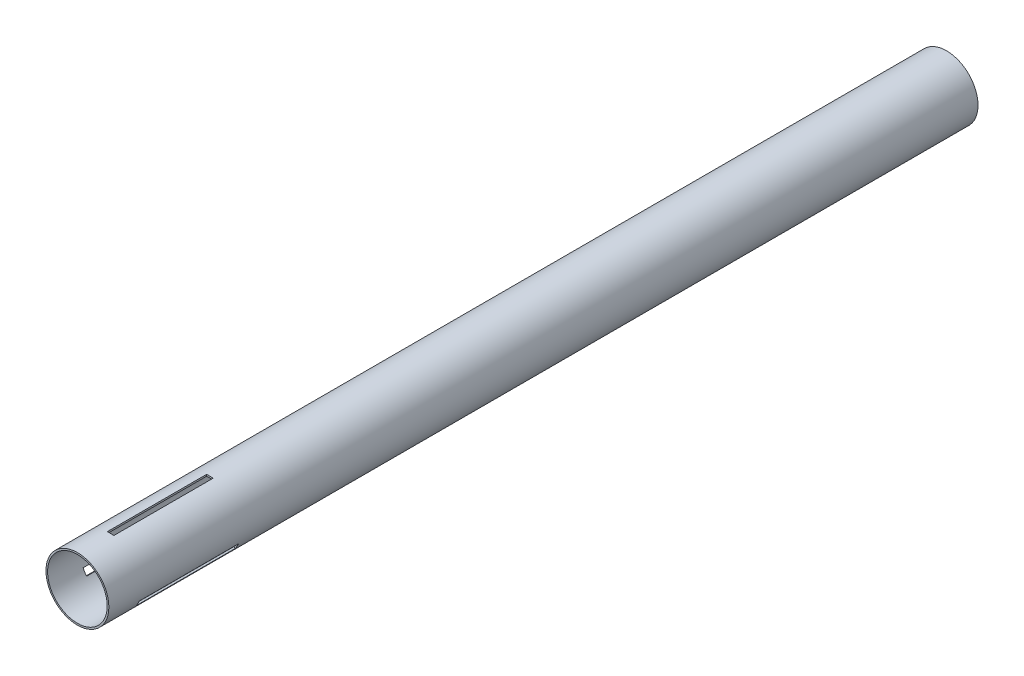
ISO-10303-21;
HEADER;
FILE_DESCRIPTION(('STEP AP214'),'2;1');
FILE_NAME('part.step','',(''),(''),'','','');
FILE_SCHEMA(('AUTOMOTIVE_DESIGN { 1 0 10303 214 1 1 1 1 }'));
ENDSEC;
DATA;
#1=APPLICATION_CONTEXT('core data for automotive mechanical design processes');
#2=APPLICATION_PROTOCOL_DEFINITION('international standard','automotive_design',2000,#1);
#3=PRODUCT_CONTEXT('',#1,'mechanical');
#4=PRODUCT('Part','Part','',(#3));
#5=PRODUCT_RELATED_PRODUCT_CATEGORY('part','',(#4));
#6=PRODUCT_DEFINITION_FORMATION('','',#4);
#7=PRODUCT_DEFINITION_CONTEXT('part definition',#1,'design');
#8=PRODUCT_DEFINITION('design','',#6,#7);
#9=PRODUCT_DEFINITION_SHAPE('','',#8);
#10=(LENGTH_UNIT() NAMED_UNIT(*) SI_UNIT(.MILLI.,.METRE.));
#11=(NAMED_UNIT(*) PLANE_ANGLE_UNIT() SI_UNIT($,.RADIAN.));
#12=(NAMED_UNIT(*) SI_UNIT($,.STERADIAN.) SOLID_ANGLE_UNIT());
#13=UNCERTAINTY_MEASURE_WITH_UNIT(LENGTH_MEASURE(1.E-05),#10,'distance_accuracy_value','');
#14=(GEOMETRIC_REPRESENTATION_CONTEXT(3) GLOBAL_UNCERTAINTY_ASSIGNED_CONTEXT((#13)) GLOBAL_UNIT_ASSIGNED_CONTEXT((#10,
#11,#12)) REPRESENTATION_CONTEXT('',''));
#15=CARTESIAN_POINT('',(0.,0.,0.));
#16=DIRECTION('',(0.,0.,1.));
#17=DIRECTION('',(1.,0.,0.));
#18=AXIS2_PLACEMENT_3D('',#15,#16,#17);
#19=CARTESIAN_POINT('',(0.,0.,525.));
#20=DIRECTION('',(0.,0.,1.));
#21=DIRECTION('',(1.,0.,0.));
#22=AXIS2_PLACEMENT_3D('',#19,#20,#21);
#23=PLANE('',#22);
#24=CARTESIAN_POINT('',(0.,0.,525.));
#25=DIRECTION('',(0.,0.,1.));
#26=DIRECTION('',(1.,0.,0.));
#27=AXIS2_PLACEMENT_3D('',#24,#25,#26);
#28=CIRCLE('',#27,19.);
#29=CARTESIAN_POINT('',(19.,0.,525.));
#30=VERTEX_POINT('',#29);
#31=EDGE_CURVE('E11',#30,#30,#28,.T.);
#32=ORIENTED_EDGE('',*,*,#31,.T.);
#33=EDGE_LOOP('',(#32));
#34=FACE_BOUND('',#33,.T.);
#35=CARTESIAN_POINT('',(0.,0.,525.));
#36=DIRECTION('',(0.,0.,1.));
#37=DIRECTION('',(1.,0.,0.));
#38=AXIS2_PLACEMENT_3D('',#35,#36,#37);
#39=CIRCLE('',#38,18.);
#40=CARTESIAN_POINT('',(18.,0.,525.));
#41=VERTEX_POINT('',#40);
#42=EDGE_CURVE('E213',#41,#41,#39,.T.);
#43=ORIENTED_EDGE('',*,*,#42,.F.);
#44=EDGE_LOOP('',(#43));
#45=FACE_BOUND('',#44,.T.);
#46=ADVANCED_FACE('F33',(#34,#45),#23,.T.);
#47=CARTESIAN_POINT('',(0.,0.,0.));
#48=DIRECTION('',(0.,0.,1.));
#49=DIRECTION('',(1.,0.,0.));
#50=AXIS2_PLACEMENT_3D('',#47,#48,#49);
#51=PLANE('',#50);
#52=CARTESIAN_POINT('',(0.,0.,0.));
#53=DIRECTION('',(0.,0.,1.));
#54=DIRECTION('',(1.,0.,0.));
#55=AXIS2_PLACEMENT_3D('',#52,#53,#54);
#56=CIRCLE('',#55,19.);
#57=CARTESIAN_POINT('',(19.,0.,0.));
#58=VERTEX_POINT('',#57);
#59=EDGE_CURVE('E37',#58,#58,#56,.T.);
#60=ORIENTED_EDGE('',*,*,#59,.F.);
#61=EDGE_LOOP('',(#60));
#62=FACE_BOUND('',#61,.T.);
#63=CARTESIAN_POINT('',(0.,0.,0.));
#64=DIRECTION('',(0.,0.,1.));
#65=DIRECTION('',(1.,0.,0.));
#66=AXIS2_PLACEMENT_3D('',#63,#64,#65);
#67=CIRCLE('',#66,18.);
#68=CARTESIAN_POINT('',(18.,0.,0.));
#69=VERTEX_POINT('',#68);
#70=EDGE_CURVE('E212',#69,#69,#67,.T.);
#71=ORIENTED_EDGE('',*,*,#70,.T.);
#72=EDGE_LOOP('',(#71));
#73=FACE_BOUND('',#72,.T.);
#74=ADVANCED_FACE('F219',(#62,#73),#51,.F.);
#75=CARTESIAN_POINT('',(0.,0.,525.));
#76=DIRECTION('',(0.,0.,-1.));
#77=DIRECTION('',(-1.,0.,0.));
#78=AXIS2_PLACEMENT_3D('',#75,#76,#77);
#79=CYLINDRICAL_SURFACE('',#78,19.);
#80=CARTESIAN_POINT('',(0.,0.,445.));
#81=DIRECTION('',(0.,0.,-1.));
#82=DIRECTION('',(0.499999999999992,-0.866025403784443,0.));
#83=AXIS2_PLACEMENT_3D('',#80,#81,#82);
#84=CIRCLE('',#83,19.);
#85=CARTESIAN_POINT('',(-17.3630681719536,-7.71517100627655,445.));
#86=VERTEX_POINT('',#85);
#87=CARTESIAN_POINT('',(-15.3630681719537,-11.1792726214143,445.));
#88=VERTEX_POINT('',#87);
#89=EDGE_CURVE('E140',#86,#88,#84,.F.);
#90=ORIENTED_EDGE('',*,*,#89,.F.);
#91=DIRECTION('',(0.,0.,-1.));
#92=VECTOR('',#91,1.);
#93=CARTESIAN_POINT('',(-17.3630681719536,-7.71517100627655,525.));
#94=LINE('',#93,#92);
#95=CARTESIAN_POINT('',(-17.3630681719536,-7.71517100627655,505.));
#96=VERTEX_POINT('',#95);
#97=EDGE_CURVE('E135',#96,#86,#94,.T.);
#98=ORIENTED_EDGE('',*,*,#97,.F.);
#99=CARTESIAN_POINT('',(0.,0.,505.));
#100=DIRECTION('',(0.,0.,1.));
#101=DIRECTION('',(-0.499999999999992,0.866025403784443,0.));
#102=AXIS2_PLACEMENT_3D('',#99,#100,#101);
#103=CIRCLE('',#102,19.);
#104=CARTESIAN_POINT('',(-15.3630681719537,-11.1792726214143,505.));
#105=VERTEX_POINT('',#104);
#106=EDGE_CURVE('E124',#105,#96,#103,.F.);
#107=ORIENTED_EDGE('',*,*,#106,.F.);
#108=DIRECTION('',(0.,0.,-1.));
#109=VECTOR('',#108,1.);
#110=CARTESIAN_POINT('',(-15.3630681719537,-11.1792726214143,525.));
#111=LINE('',#110,#109);
#112=EDGE_CURVE('E48',#88,#105,#111,.F.);
#113=ORIENTED_EDGE('',*,*,#112,.F.);
#114=EDGE_LOOP('',(#90,#98,#107,#113));
#115=FACE_BOUND('',#114,.T.);
#116=CARTESIAN_POINT('',(0.,0.,445.));
#117=DIRECTION('',(0.,0.,-1.));
#118=DIRECTION('',(0.500000000000004,0.866025403784436,0.));
#119=AXIS2_PLACEMENT_3D('',#116,#117,#118);
#120=CIRCLE('',#119,19.);
#121=CARTESIAN_POINT('',(15.3630681719535,-11.1792726214145,445.));
#122=VERTEX_POINT('',#121);
#123=CARTESIAN_POINT('',(17.3630681719535,-7.71517100627679,445.));
#124=VERTEX_POINT('',#123);
#125=EDGE_CURVE('E166',#122,#124,#120,.F.);
#126=ORIENTED_EDGE('',*,*,#125,.F.);
#127=DIRECTION('',(0.,0.,-1.));
#128=VECTOR('',#127,1.);
#129=CARTESIAN_POINT('',(15.3630681719535,-11.1792726214145,525.));
#130=LINE('',#129,#128);
#131=CARTESIAN_POINT('',(15.3630681719535,-11.1792726214145,505.));
#132=VERTEX_POINT('',#131);
#133=EDGE_CURVE('E174',#132,#122,#130,.T.);
#134=ORIENTED_EDGE('',*,*,#133,.F.);
#135=CARTESIAN_POINT('',(0.,0.,505.));
#136=DIRECTION('',(0.,0.,1.));
#137=DIRECTION('',(-0.500000000000004,-0.866025403784436,0.));
#138=AXIS2_PLACEMENT_3D('',#135,#136,#137);
#139=CIRCLE('',#138,19.);
#140=CARTESIAN_POINT('',(17.3630681719535,-7.71517100627679,505.));
#141=VERTEX_POINT('',#140);
#142=EDGE_CURVE('E143',#141,#132,#139,.F.);
#143=ORIENTED_EDGE('',*,*,#142,.F.);
#144=DIRECTION('',(0.,0.,-1.));
#145=VECTOR('',#144,1.);
#146=CARTESIAN_POINT('',(17.3630681719535,-7.71517100627679,525.));
#147=LINE('',#146,#145);
#148=EDGE_CURVE('E159',#124,#141,#147,.F.);
#149=ORIENTED_EDGE('',*,*,#148,.F.);
#150=EDGE_LOOP('',(#126,#134,#143,#149));
#151=FACE_BOUND('',#150,.T.);
#152=CARTESIAN_POINT('',(0.,0.,445.));
#153=DIRECTION('',(0.,0.,-1.));
#154=DIRECTION('',(-1.,0.,0.));
#155=AXIS2_PLACEMENT_3D('',#152,#153,#154);
#156=CIRCLE('',#155,19.);
#157=CARTESIAN_POINT('',(2.,18.8944436276912,445.));
#158=VERTEX_POINT('',#157);
#159=CARTESIAN_POINT('',(-2.,18.8944436276912,445.));
#160=VERTEX_POINT('',#159);
#161=EDGE_CURVE('E181',#158,#160,#156,.F.);
#162=ORIENTED_EDGE('',*,*,#161,.F.);
#163=DIRECTION('',(0.,0.,-1.));
#164=VECTOR('',#163,1.);
#165=CARTESIAN_POINT('',(2.,18.8944436276912,525.));
#166=LINE('',#165,#164);
#167=CARTESIAN_POINT('',(2.,18.8944436276912,505.));
#168=VERTEX_POINT('',#167);
#169=EDGE_CURVE('E184',#168,#158,#166,.T.);
#170=ORIENTED_EDGE('',*,*,#169,.F.);
#171=CARTESIAN_POINT('',(0.,0.,505.));
#172=DIRECTION('',(0.,0.,1.));
#173=DIRECTION('',(1.,0.,0.));
#174=AXIS2_PLACEMENT_3D('',#171,#172,#173);
#175=CIRCLE('',#174,19.);
#176=CARTESIAN_POINT('',(-2.,18.8944436276912,505.));
#177=VERTEX_POINT('',#176);
#178=EDGE_CURVE('E186',#177,#168,#175,.F.);
#179=ORIENTED_EDGE('',*,*,#178,.F.);
#180=DIRECTION('',(0.,0.,-1.));
#181=VECTOR('',#180,1.);
#182=CARTESIAN_POINT('',(-2.,18.8944436276912,525.));
#183=LINE('',#182,#181);
#184=EDGE_CURVE('E180',#160,#177,#183,.F.);
#185=ORIENTED_EDGE('',*,*,#184,.F.);
#186=EDGE_LOOP('',(#162,#170,#179,#185));
#187=FACE_BOUND('',#186,.T.);
#188=ORIENTED_EDGE('',*,*,#31,.F.);
#189=EDGE_LOOP('',(#188));
#190=FACE_BOUND('',#189,.T.);
#191=ORIENTED_EDGE('',*,*,#59,.T.);
#192=EDGE_LOOP('',(#191));
#193=FACE_BOUND('',#192,.T.);
#194=ADVANCED_FACE('F35',(#115,#151,#187,#190,#193),#79,.T.);
#195=CARTESIAN_POINT('',(0.,0.,525.));
#196=DIRECTION('',(0.,0.,-1.));
#197=DIRECTION('',(-1.,0.,0.));
#198=AXIS2_PLACEMENT_3D('',#195,#196,#197);
#199=CYLINDRICAL_SURFACE('',#198,18.);
#200=DIRECTION('',(0.,0.,-1.));
#201=VECTOR('',#200,1.);
#202=CARTESIAN_POINT('',(-16.4919333848297,-7.21222110243013,525.));
#203=LINE('',#202,#201);
#204=CARTESIAN_POINT('',(-16.4919333848297,-7.21222110243013,505.));
#205=VERTEX_POINT('',#204);
#206=CARTESIAN_POINT('',(-16.4919333848297,-7.21222110243013,445.));
#207=VERTEX_POINT('',#206);
#208=EDGE_CURVE('E56',#205,#207,#203,.T.);
#209=ORIENTED_EDGE('',*,*,#208,.T.);
#210=CARTESIAN_POINT('',(0.,0.,445.));
#211=DIRECTION('',(0.,0.,-1.));
#212=DIRECTION('',(0.499999999999992,-0.866025403784443,0.));
#213=AXIS2_PLACEMENT_3D('',#210,#211,#212);
#214=CIRCLE('',#213,18.);
#215=CARTESIAN_POINT('',(-14.4919333848298,-10.6763227175679,445.));
#216=VERTEX_POINT('',#215);
#217=EDGE_CURVE('E145',#207,#216,#214,.F.);
#218=ORIENTED_EDGE('',*,*,#217,.T.);
#219=DIRECTION('',(0.,0.,-1.));
#220=VECTOR('',#219,1.);
#221=CARTESIAN_POINT('',(-14.4919333848298,-10.6763227175679,525.));
#222=LINE('',#221,#220);
#223=CARTESIAN_POINT('',(-14.4919333848298,-10.6763227175679,505.));
#224=VERTEX_POINT('',#223);
#225=EDGE_CURVE('E387',#216,#224,#222,.F.);
#226=ORIENTED_EDGE('',*,*,#225,.T.);
#227=CARTESIAN_POINT('',(0.,0.,505.));
#228=DIRECTION('',(0.,0.,1.));
#229=DIRECTION('',(-0.499999999999992,0.866025403784443,0.));
#230=AXIS2_PLACEMENT_3D('',#227,#228,#229);
#231=CIRCLE('',#230,18.);
#232=EDGE_CURVE('E131',#224,#205,#231,.F.);
#233=ORIENTED_EDGE('',*,*,#232,.T.);
#234=EDGE_LOOP('',(#209,#218,#226,#233));
#235=FACE_BOUND('',#234,.T.);
#236=DIRECTION('',(0.,0.,-1.));
#237=VECTOR('',#236,1.);
#238=CARTESIAN_POINT('',(14.4919333848296,-10.6763227175681,525.));
#239=LINE('',#238,#237);
#240=CARTESIAN_POINT('',(14.4919333848296,-10.6763227175681,505.));
#241=VERTEX_POINT('',#240);
#242=CARTESIAN_POINT('',(14.4919333848296,-10.6763227175681,445.));
#243=VERTEX_POINT('',#242);
#244=EDGE_CURVE('E177',#241,#243,#239,.T.);
#245=ORIENTED_EDGE('',*,*,#244,.T.);
#246=CARTESIAN_POINT('',(0.,0.,445.));
#247=DIRECTION('',(0.,0.,-1.));
#248=DIRECTION('',(0.500000000000004,0.866025403784436,0.));
#249=AXIS2_PLACEMENT_3D('',#246,#247,#248);
#250=CIRCLE('',#249,18.);
#251=CARTESIAN_POINT('',(16.4919333848296,-7.21222110243036,445.));
#252=VERTEX_POINT('',#251);
#253=EDGE_CURVE('E169',#243,#252,#250,.F.);
#254=ORIENTED_EDGE('',*,*,#253,.T.);
#255=DIRECTION('',(0.,0.,-1.));
#256=VECTOR('',#255,1.);
#257=CARTESIAN_POINT('',(16.4919333848296,-7.21222110243036,525.));
#258=LINE('',#257,#256);
#259=CARTESIAN_POINT('',(16.4919333848296,-7.21222110243036,505.));
#260=VERTEX_POINT('',#259);
#261=EDGE_CURVE('E161',#252,#260,#258,.F.);
#262=ORIENTED_EDGE('',*,*,#261,.T.);
#263=CARTESIAN_POINT('',(0.,0.,505.));
#264=DIRECTION('',(0.,0.,1.));
#265=DIRECTION('',(-0.500000000000004,-0.866025403784436,0.));
#266=AXIS2_PLACEMENT_3D('',#263,#264,#265);
#267=CIRCLE('',#266,18.);
#268=EDGE_CURVE('E150',#260,#241,#267,.F.);
#269=ORIENTED_EDGE('',*,*,#268,.T.);
#270=EDGE_LOOP('',(#245,#254,#262,#269));
#271=FACE_BOUND('',#270,.T.);
#272=DIRECTION('',(0.,0.,-1.));
#273=VECTOR('',#272,1.);
#274=CARTESIAN_POINT('',(2.,17.8885438199983,525.));
#275=LINE('',#274,#273);
#276=CARTESIAN_POINT('',(2.,17.8885438199983,505.));
#277=VERTEX_POINT('',#276);
#278=CARTESIAN_POINT('',(2.,17.8885438199983,445.));
#279=VERTEX_POINT('',#278);
#280=EDGE_CURVE('E203',#277,#279,#275,.T.);
#281=ORIENTED_EDGE('',*,*,#280,.T.);
#282=CARTESIAN_POINT('',(0.,0.,445.));
#283=DIRECTION('',(0.,0.,-1.));
#284=DIRECTION('',(-1.,0.,0.));
#285=AXIS2_PLACEMENT_3D('',#282,#283,#284);
#286=CIRCLE('',#285,18.);
#287=CARTESIAN_POINT('',(-2.,17.8885438199983,445.));
#288=VERTEX_POINT('',#287);
#289=EDGE_CURVE('E183',#279,#288,#286,.F.);
#290=ORIENTED_EDGE('',*,*,#289,.T.);
#291=DIRECTION('',(0.,0.,-1.));
#292=VECTOR('',#291,1.);
#293=CARTESIAN_POINT('',(-2.,17.8885438199983,525.));
#294=LINE('',#293,#292);
#295=CARTESIAN_POINT('',(-2.,17.8885438199983,505.));
#296=VERTEX_POINT('',#295);
#297=EDGE_CURVE('E193',#288,#296,#294,.F.);
#298=ORIENTED_EDGE('',*,*,#297,.T.);
#299=CARTESIAN_POINT('',(0.,0.,505.));
#300=DIRECTION('',(0.,0.,1.));
#301=DIRECTION('',(1.,0.,0.));
#302=AXIS2_PLACEMENT_3D('',#299,#300,#301);
#303=CIRCLE('',#302,18.);
#304=EDGE_CURVE('E196',#296,#277,#303,.F.);
#305=ORIENTED_EDGE('',*,*,#304,.T.);
#306=EDGE_LOOP('',(#281,#290,#298,#305));
#307=FACE_BOUND('',#306,.T.);
#308=ORIENTED_EDGE('',*,*,#42,.T.);
#309=EDGE_LOOP('',(#308));
#310=FACE_BOUND('',#309,.T.);
#311=ORIENTED_EDGE('',*,*,#70,.F.);
#312=EDGE_LOOP('',(#311));
#313=FACE_BOUND('',#312,.T.);
#314=ADVANCED_FACE('F221',(#235,#271,#307,#310,#313),#199,.F.);
#315=CARTESIAN_POINT('',(2.,-19.001,505.));
#316=DIRECTION('',(1.,0.,0.));
#317=DIRECTION('',(0.,0.,-1.));
#318=AXIS2_PLACEMENT_3D('',#315,#316,#317);
#319=PLANE('',#318);
#320=ORIENTED_EDGE('',*,*,#169,.T.);
#321=DIRECTION('',(0.,1.,0.));
#322=VECTOR('',#321,1.);
#323=CARTESIAN_POINT('',(2.,-19.001,445.));
#324=LINE('',#323,#322);
#325=EDGE_CURVE('E207',#279,#158,#324,.T.);
#326=ORIENTED_EDGE('',*,*,#325,.F.);
#327=ORIENTED_EDGE('',*,*,#280,.F.);
#328=DIRECTION('',(0.,1.,0.));
#329=VECTOR('',#328,1.);
#330=CARTESIAN_POINT('',(2.,-19.001,505.));
#331=LINE('',#330,#329);
#332=EDGE_CURVE('E199',#277,#168,#331,.T.);
#333=ORIENTED_EDGE('',*,*,#332,.T.);
#334=EDGE_LOOP('',(#320,#326,#327,#333));
#335=FACE_BOUND('',#334,.T.);
#336=ADVANCED_FACE('F223',(#335),#319,.F.);
#337=CARTESIAN_POINT('',(-2.,-19.001,445.));
#338=DIRECTION('',(0.,0.,-1.));
#339=DIRECTION('',(-1.,0.,0.));
#340=AXIS2_PLACEMENT_3D('',#337,#338,#339);
#341=PLANE('',#340);
#342=ORIENTED_EDGE('',*,*,#161,.T.);
#343=DIRECTION('',(0.,1.,0.));
#344=VECTOR('',#343,1.);
#345=CARTESIAN_POINT('',(-2.,-19.001,445.));
#346=LINE('',#345,#344);
#347=EDGE_CURVE('E204',#288,#160,#346,.T.);
#348=ORIENTED_EDGE('',*,*,#347,.F.);
#349=ORIENTED_EDGE('',*,*,#289,.F.);
#350=ORIENTED_EDGE('',*,*,#325,.T.);
#351=EDGE_LOOP('',(#342,#348,#349,#350));
#352=FACE_BOUND('',#351,.T.);
#353=ADVANCED_FACE('F230',(#352),#341,.F.);
#354=CARTESIAN_POINT('',(-2.,-19.001,505.));
#355=DIRECTION('',(-1.,0.,0.));
#356=DIRECTION('',(0.,0.,1.));
#357=AXIS2_PLACEMENT_3D('',#354,#355,#356);
#358=PLANE('',#357);
#359=ORIENTED_EDGE('',*,*,#184,.T.);
#360=DIRECTION('',(0.,1.,0.));
#361=VECTOR('',#360,1.);
#362=CARTESIAN_POINT('',(-2.,-19.001,505.));
#363=LINE('',#362,#361);
#364=EDGE_CURVE('E200',#296,#177,#363,.T.);
#365=ORIENTED_EDGE('',*,*,#364,.F.);
#366=ORIENTED_EDGE('',*,*,#297,.F.);
#367=ORIENTED_EDGE('',*,*,#347,.T.);
#368=EDGE_LOOP('',(#359,#365,#366,#367));
#369=FACE_BOUND('',#368,.T.);
#370=ADVANCED_FACE('F348',(#369),#358,.F.);
#371=CARTESIAN_POINT('',(-2.,-19.001,505.));
#372=DIRECTION('',(0.,0.,1.));
#373=DIRECTION('',(1.,0.,0.));
#374=AXIS2_PLACEMENT_3D('',#371,#372,#373);
#375=PLANE('',#374);
#376=ORIENTED_EDGE('',*,*,#178,.T.);
#377=ORIENTED_EDGE('',*,*,#332,.F.);
#378=ORIENTED_EDGE('',*,*,#304,.F.);
#379=ORIENTED_EDGE('',*,*,#364,.T.);
#380=EDGE_LOOP('',(#376,#377,#378,#379));
#381=FACE_BOUND('',#380,.T.);
#382=ADVANCED_FACE('F263',(#381),#375,.F.);
#383=CARTESIAN_POINT('',(-17.4553486973081,7.7684491924312,505.));
#384=DIRECTION('',(-0.500000000000004,-0.866025403784436,0.));
#385=DIRECTION('',(0.,0.,-1.));
#386=AXIS2_PLACEMENT_3D('',#383,#384,#385);
#387=PLANE('',#386);
#388=ORIENTED_EDGE('',*,*,#133,.T.);
#389=DIRECTION('',(0.866025403784436,-0.500000000000004,0.));
#390=VECTOR('',#389,1.);
#391=CARTESIAN_POINT('',(-17.4553486973081,7.7684491924312,445.));
#392=LINE('',#391,#390);
#393=EDGE_CURVE('E172',#243,#122,#392,.T.);
#394=ORIENTED_EDGE('',*,*,#393,.F.);
#395=ORIENTED_EDGE('',*,*,#244,.F.);
#396=DIRECTION('',(0.866025403784436,-0.500000000000004,0.));
#397=VECTOR('',#396,1.);
#398=CARTESIAN_POINT('',(-17.4553486973081,7.7684491924312,505.));
#399=LINE('',#398,#397);
#400=EDGE_CURVE('E153',#241,#132,#399,.T.);
#401=ORIENTED_EDGE('',*,*,#400,.T.);
#402=EDGE_LOOP('',(#388,#394,#395,#401));
#403=FACE_BOUND('',#402,.T.);
#404=ADVANCED_FACE('F273',(#403),#387,.F.);
#405=CARTESIAN_POINT('',(-15.4553486973081,11.232550807569,445.));
#406=DIRECTION('',(0.,0.,-1.));
#407=DIRECTION('',(0.500000000000004,0.866025403784436,0.));
#408=AXIS2_PLACEMENT_3D('',#405,#406,#407);
#409=PLANE('',#408);
#410=ORIENTED_EDGE('',*,*,#125,.T.);
#411=DIRECTION('',(0.866025403784436,-0.500000000000004,0.));
#412=VECTOR('',#411,1.);
#413=CARTESIAN_POINT('',(-15.4553486973081,11.232550807569,445.));
#414=LINE('',#413,#412);
#415=EDGE_CURVE('E164',#252,#124,#414,.T.);
#416=ORIENTED_EDGE('',*,*,#415,.F.);
#417=ORIENTED_EDGE('',*,*,#253,.F.);
#418=ORIENTED_EDGE('',*,*,#393,.T.);
#419=EDGE_LOOP('',(#410,#416,#417,#418));
#420=FACE_BOUND('',#419,.T.);
#421=ADVANCED_FACE('F278',(#420),#409,.F.);
#422=CARTESIAN_POINT('',(-15.4553486973081,11.232550807569,505.));
#423=DIRECTION('',(0.500000000000004,0.866025403784436,0.));
#424=DIRECTION('',(0.,0.,1.));
#425=AXIS2_PLACEMENT_3D('',#422,#423,#424);
#426=PLANE('',#425);
#427=ORIENTED_EDGE('',*,*,#148,.T.);
#428=DIRECTION('',(0.866025403784436,-0.500000000000004,0.));
#429=VECTOR('',#428,1.);
#430=CARTESIAN_POINT('',(-15.4553486973081,11.232550807569,505.));
#431=LINE('',#430,#429);
#432=EDGE_CURVE('E156',#260,#141,#431,.T.);
#433=ORIENTED_EDGE('',*,*,#432,.F.);
#434=ORIENTED_EDGE('',*,*,#261,.F.);
#435=ORIENTED_EDGE('',*,*,#415,.T.);
#436=EDGE_LOOP('',(#427,#433,#434,#435));
#437=FACE_BOUND('',#436,.T.);
#438=ADVANCED_FACE('F288',(#437),#426,.F.);
#439=CARTESIAN_POINT('',(-15.4553486973081,11.232550807569,505.));
#440=DIRECTION('',(0.,0.,1.));
#441=DIRECTION('',(-0.500000000000004,-0.866025403784436,0.));
#442=AXIS2_PLACEMENT_3D('',#439,#440,#441);
#443=PLANE('',#442);
#444=ORIENTED_EDGE('',*,*,#142,.T.);
#445=ORIENTED_EDGE('',*,*,#400,.F.);
#446=ORIENTED_EDGE('',*,*,#268,.F.);
#447=ORIENTED_EDGE('',*,*,#432,.T.);
#448=EDGE_LOOP('',(#444,#445,#446,#447));
#449=FACE_BOUND('',#448,.T.);
#450=ADVANCED_FACE('F298',(#449),#443,.F.);
#451=CARTESIAN_POINT('',(15.4553486973082,11.2325508075687,505.));
#452=DIRECTION('',(-0.499999999999992,0.866025403784443,0.));
#453=DIRECTION('',(0.,0.,-1.));
#454=AXIS2_PLACEMENT_3D('',#451,#452,#453);
#455=PLANE('',#454);
#456=ORIENTED_EDGE('',*,*,#97,.T.);
#457=DIRECTION('',(-0.866025403784443,-0.499999999999992,0.));
#458=VECTOR('',#457,1.);
#459=CARTESIAN_POINT('',(15.4553486973082,11.2325508075687,445.));
#460=LINE('',#459,#458);
#461=EDGE_CURVE('E141',#207,#86,#460,.T.);
#462=ORIENTED_EDGE('',*,*,#461,.F.);
#463=ORIENTED_EDGE('',*,*,#208,.F.);
#464=DIRECTION('',(-0.866025403784443,-0.499999999999992,0.));
#465=VECTOR('',#464,1.);
#466=CARTESIAN_POINT('',(15.4553486973082,11.2325508075687,505.));
#467=LINE('',#466,#465);
#468=EDGE_CURVE('E126',#205,#96,#467,.T.);
#469=ORIENTED_EDGE('',*,*,#468,.T.);
#470=EDGE_LOOP('',(#456,#462,#463,#469));
#471=FACE_BOUND('',#470,.T.);
#472=ADVANCED_FACE('F134',(#471),#455,.F.);
#473=CARTESIAN_POINT('',(17.4553486973082,7.76844919243096,445.));
#474=DIRECTION('',(0.,0.,-1.));
#475=DIRECTION('',(0.499999999999992,-0.866025403784443,0.));
#476=AXIS2_PLACEMENT_3D('',#473,#474,#475);
#477=PLANE('',#476);
#478=ORIENTED_EDGE('',*,*,#89,.T.);
#479=DIRECTION('',(-0.866025403784443,-0.499999999999992,0.));
#480=VECTOR('',#479,1.);
#481=CARTESIAN_POINT('',(17.4553486973082,7.76844919243096,445.));
#482=LINE('',#481,#480);
#483=EDGE_CURVE('E384',#216,#88,#482,.T.);
#484=ORIENTED_EDGE('',*,*,#483,.F.);
#485=ORIENTED_EDGE('',*,*,#217,.F.);
#486=ORIENTED_EDGE('',*,*,#461,.T.);
#487=EDGE_LOOP('',(#478,#484,#485,#486));
#488=FACE_BOUND('',#487,.T.);
#489=ADVANCED_FACE('F317',(#488),#477,.F.);
#490=CARTESIAN_POINT('',(17.4553486973082,7.76844919243096,505.));
#491=DIRECTION('',(0.499999999999992,-0.866025403784443,0.));
#492=DIRECTION('',(0.,0.,1.));
#493=AXIS2_PLACEMENT_3D('',#490,#491,#492);
#494=PLANE('',#493);
#495=ORIENTED_EDGE('',*,*,#112,.T.);
#496=DIRECTION('',(-0.866025403784443,-0.499999999999992,0.));
#497=VECTOR('',#496,1.);
#498=CARTESIAN_POINT('',(17.4553486973082,7.76844919243096,505.));
#499=LINE('',#498,#497);
#500=EDGE_CURVE('E128',#224,#105,#499,.T.);
#501=ORIENTED_EDGE('',*,*,#500,.F.);
#502=ORIENTED_EDGE('',*,*,#225,.F.);
#503=ORIENTED_EDGE('',*,*,#483,.T.);
#504=EDGE_LOOP('',(#495,#501,#502,#503));
#505=FACE_BOUND('',#504,.T.);
#506=ADVANCED_FACE('F326',(#505),#494,.F.);
#507=CARTESIAN_POINT('',(17.4553486973082,7.76844919243096,505.));
#508=DIRECTION('',(0.,0.,1.));
#509=DIRECTION('',(-0.499999999999992,0.866025403784443,0.));
#510=AXIS2_PLACEMENT_3D('',#507,#508,#509);
#511=PLANE('',#510);
#512=ORIENTED_EDGE('',*,*,#106,.T.);
#513=ORIENTED_EDGE('',*,*,#468,.F.);
#514=ORIENTED_EDGE('',*,*,#232,.F.);
#515=ORIENTED_EDGE('',*,*,#500,.T.);
#516=EDGE_LOOP('',(#512,#513,#514,#515));
#517=FACE_BOUND('',#516,.T.);
#518=ADVANCED_FACE('F125',(#517),#511,.F.);
#519=CLOSED_SHELL('',(#46,#74,#194,#314,#336,#353,#370,#382,#404,#421,#438,#450,#472,#489,#506,#518));
#520=MANIFOLD_SOLID_BREP('B2',#519);
#521=ADVANCED_BREP_SHAPE_REPRESENTATION('',(#18,#520),#14);
#522=SHAPE_DEFINITION_REPRESENTATION(#9,#521);
ENDSEC;
END-ISO-10303-21;
